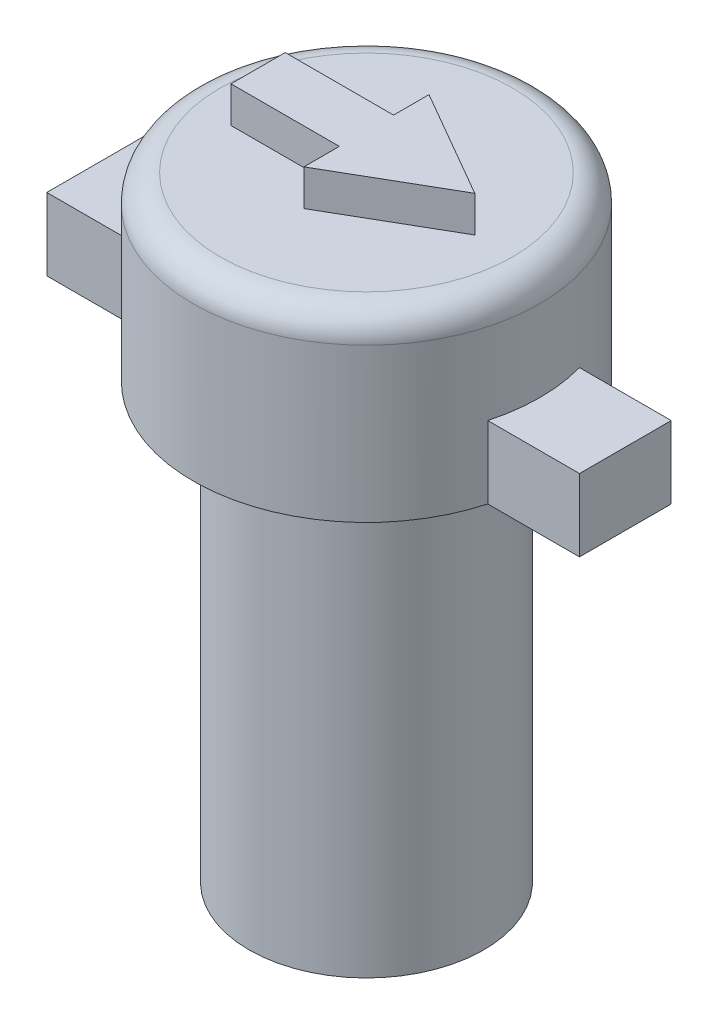
ISO-10303-21;
HEADER;
FILE_DESCRIPTION(('STEP AP214'),'2;1');
FILE_NAME('part.step','',(''),(''),'','','');
FILE_SCHEMA(('AUTOMOTIVE_DESIGN { 1 0 10303 214 1 1 1 1 }'));
ENDSEC;
DATA;
#1=APPLICATION_CONTEXT('core data for automotive mechanical design processes');
#2=APPLICATION_PROTOCOL_DEFINITION('international standard','automotive_design',2000,#1);
#3=PRODUCT_CONTEXT('',#1,'mechanical');
#4=PRODUCT('Part','Part','',(#3));
#5=PRODUCT_RELATED_PRODUCT_CATEGORY('part','',(#4));
#6=PRODUCT_DEFINITION_FORMATION('','',#4);
#7=PRODUCT_DEFINITION_CONTEXT('part definition',#1,'design');
#8=PRODUCT_DEFINITION('design','',#6,#7);
#9=PRODUCT_DEFINITION_SHAPE('','',#8);
#10=(LENGTH_UNIT() NAMED_UNIT(*) SI_UNIT(.MILLI.,.METRE.));
#11=(NAMED_UNIT(*) PLANE_ANGLE_UNIT() SI_UNIT($,.RADIAN.));
#12=(NAMED_UNIT(*) SI_UNIT($,.STERADIAN.) SOLID_ANGLE_UNIT());
#13=UNCERTAINTY_MEASURE_WITH_UNIT(LENGTH_MEASURE(1.E-05),#10,'distance_accuracy_value','');
#14=(GEOMETRIC_REPRESENTATION_CONTEXT(3) GLOBAL_UNCERTAINTY_ASSIGNED_CONTEXT((#13)) GLOBAL_UNIT_ASSIGNED_CONTEXT((#10,
#11,#12)) REPRESENTATION_CONTEXT('',''));
#15=CARTESIAN_POINT('',(0.,0.,0.));
#16=DIRECTION('',(0.,0.,1.));
#17=DIRECTION('',(1.,0.,0.));
#18=AXIS2_PLACEMENT_3D('',#15,#16,#17);
#19=CARTESIAN_POINT('',(0.,17.018,0.));
#20=DIRECTION('',(0.,1.,0.));
#21=DIRECTION('',(0.,0.,1.));
#22=AXIS2_PLACEMENT_3D('',#19,#20,#21);
#23=PLANE('',#22);
#24=CARTESIAN_POINT('',(0.,17.018,0.));
#25=DIRECTION('',(0.,1.,0.));
#26=DIRECTION('',(0.,0.,1.));
#27=AXIS2_PLACEMENT_3D('',#24,#25,#26);
#28=CIRCLE('',#27,4.05);
#29=CARTESIAN_POINT('',(0.,17.018,4.05));
#30=VERTEX_POINT('',#29);
#31=EDGE_CURVE('E73',#30,#30,#28,.T.);
#32=ORIENTED_EDGE('',*,*,#31,.T.);
#33=EDGE_LOOP('',(#32));
#34=FACE_BOUND('',#33,.T.);
#35=DIRECTION('',(-1.,0.,0.));
#36=VECTOR('',#35,1.);
#37=CARTESIAN_POINT('',(0.,17.018,-0.75));
#38=LINE('',#37,#36);
#39=CARTESIAN_POINT('',(0.,17.018,-0.75));
#40=VERTEX_POINT('',#39);
#41=CARTESIAN_POINT('',(-3.,17.018,-0.75));
#42=VERTEX_POINT('',#41);
#43=EDGE_CURVE('E286',#40,#42,#38,.T.);
#44=ORIENTED_EDGE('',*,*,#43,.F.);
#45=DIRECTION('',(0.,0.,1.));
#46=VECTOR('',#45,1.);
#47=CARTESIAN_POINT('',(0.,17.018,-1.73205080756888));
#48=LINE('',#47,#46);
#49=CARTESIAN_POINT('',(0.,17.018,-1.73205080756888));
#50=VERTEX_POINT('',#49);
#51=EDGE_CURVE('E214',#50,#40,#48,.T.);
#52=ORIENTED_EDGE('',*,*,#51,.F.);
#53=DIRECTION('',(-0.866025403784438,0.,-0.5));
#54=VECTOR('',#53,1.);
#55=CARTESIAN_POINT('',(3.,17.018,0.));
#56=LINE('',#55,#54);
#57=CARTESIAN_POINT('',(3.,17.018,0.));
#58=VERTEX_POINT('',#57);
#59=EDGE_CURVE('E264',#58,#50,#56,.T.);
#60=ORIENTED_EDGE('',*,*,#59,.F.);
#61=DIRECTION('',(0.866025403784439,0.,-0.5));
#62=VECTOR('',#61,1.);
#63=CARTESIAN_POINT('',(0.,17.018,1.73205080756888));
#64=LINE('',#63,#62);
#65=CARTESIAN_POINT('',(0.,17.018,1.73205080756888));
#66=VERTEX_POINT('',#65);
#67=EDGE_CURVE('E298',#66,#58,#64,.T.);
#68=ORIENTED_EDGE('',*,*,#67,.F.);
#69=DIRECTION('',(0.,0.,1.));
#70=VECTOR('',#69,1.);
#71=CARTESIAN_POINT('',(0.,17.018,0.75));
#72=LINE('',#71,#70);
#73=CARTESIAN_POINT('',(0.,17.018,0.75));
#74=VERTEX_POINT('',#73);
#75=EDGE_CURVE('E295',#74,#66,#72,.T.);
#76=ORIENTED_EDGE('',*,*,#75,.F.);
#77=DIRECTION('',(1.,0.,0.));
#78=VECTOR('',#77,1.);
#79=CARTESIAN_POINT('',(-3.,17.018,0.75));
#80=LINE('',#79,#78);
#81=CARTESIAN_POINT('',(-3.,17.018,0.75));
#82=VERTEX_POINT('',#81);
#83=EDGE_CURVE('E292',#82,#74,#80,.T.);
#84=ORIENTED_EDGE('',*,*,#83,.F.);
#85=DIRECTION('',(0.,0.,1.));
#86=VECTOR('',#85,1.);
#87=CARTESIAN_POINT('',(-3.,17.018,-0.75));
#88=LINE('',#87,#86);
#89=EDGE_CURVE('E289',#42,#82,#88,.T.);
#90=ORIENTED_EDGE('',*,*,#89,.F.);
#91=EDGE_LOOP('',(#44,#52,#60,#68,#76,#84,#90));
#92=FACE_BOUND('',#91,.T.);
#93=ADVANCED_FACE('F64',(#34,#92),#23,.T.);
#94=CARTESIAN_POINT('',(0.,12.018,0.));
#95=DIRECTION('',(0.,-1.,0.));
#96=DIRECTION('',(0.,0.,-1.));
#97=AXIS2_PLACEMENT_3D('',#94,#95,#96);
#98=CYLINDRICAL_SURFACE('',#97,3.25);
#99=CARTESIAN_POINT('',(0.,12.018,0.));
#100=DIRECTION('',(0.,1.,0.));
#101=DIRECTION('',(0.,0.,1.));
#102=AXIS2_PLACEMENT_3D('',#99,#100,#101);
#103=CIRCLE('',#102,3.25);
#104=CARTESIAN_POINT('',(0.,12.018,3.25));
#105=VERTEX_POINT('',#104);
#106=EDGE_CURVE('E333',#105,#105,#103,.T.);
#107=ORIENTED_EDGE('',*,*,#106,.F.);
#108=EDGE_LOOP('',(#107));
#109=FACE_BOUND('',#108,.T.);
#110=CARTESIAN_POINT('',(0.,0.,0.));
#111=DIRECTION('',(0.,1.,0.));
#112=DIRECTION('',(0.,0.,1.));
#113=AXIS2_PLACEMENT_3D('',#110,#111,#112);
#114=CIRCLE('',#113,3.25);
#115=CARTESIAN_POINT('',(0.,0.,3.25));
#116=VERTEX_POINT('',#115);
#117=EDGE_CURVE('E337',#116,#116,#114,.T.);
#118=ORIENTED_EDGE('',*,*,#117,.T.);
#119=EDGE_LOOP('',(#118));
#120=FACE_BOUND('',#119,.T.);
#121=ADVANCED_FACE('F363',(#109,#120),#98,.T.);
#122=CARTESIAN_POINT('',(0.,0.,0.));
#123=DIRECTION('',(0.,1.,0.));
#124=DIRECTION('',(0.,0.,1.));
#125=AXIS2_PLACEMENT_3D('',#122,#123,#124);
#126=PLANE('',#125);
#127=ORIENTED_EDGE('',*,*,#117,.F.);
#128=EDGE_LOOP('',(#127));
#129=FACE_BOUND('',#128,.T.);
#130=ADVANCED_FACE('F368',(#129),#126,.F.);
#131=CARTESIAN_POINT('',(0.,17.018,0.));
#132=DIRECTION('',(0.,-1.,0.));
#133=DIRECTION('',(0.,0.,-1.));
#134=AXIS2_PLACEMENT_3D('',#131,#132,#133);
#135=CYLINDRICAL_SURFACE('',#134,4.8);
#136=CARTESIAN_POINT('',(0.,12.018,0.));
#137=DIRECTION('',(0.,1.,0.));
#138=DIRECTION('',(0.,0.,1.));
#139=AXIS2_PLACEMENT_3D('',#136,#137,#138);
#140=CIRCLE('',#139,4.8);
#141=CARTESIAN_POINT('',(4.62894156368386,12.018,-1.27));
#142=VERTEX_POINT('',#141);
#143=CARTESIAN_POINT('',(-4.40578880565104,12.018,-1.905));
#144=VERTEX_POINT('',#143);
#145=EDGE_CURVE('E332',#142,#144,#140,.T.);
#146=ORIENTED_EDGE('',*,*,#145,.T.);
#147=DIRECTION('',(0.,-1.,0.));
#148=VECTOR('',#147,1.);
#149=CARTESIAN_POINT('',(-4.40578880565104,14.018,-1.905));
#150=LINE('',#149,#148);
#151=CARTESIAN_POINT('',(-4.40578880565104,14.018,-1.905));
#152=VERTEX_POINT('',#151);
#153=EDGE_CURVE('E80',#152,#144,#150,.T.);
#154=ORIENTED_EDGE('',*,*,#153,.F.);
#155=CARTESIAN_POINT('',(0.,14.018,0.));
#156=DIRECTION('',(0.,1.,0.));
#157=DIRECTION('',(0.,0.,-1.));
#158=AXIS2_PLACEMENT_3D('',#155,#156,#157);
#159=CIRCLE('',#158,4.8);
#160=CARTESIAN_POINT('',(-4.40578880565104,14.018,1.905));
#161=VERTEX_POINT('',#160);
#162=EDGE_CURVE('E84',#152,#161,#159,.T.);
#163=ORIENTED_EDGE('',*,*,#162,.T.);
#164=DIRECTION('',(0.,-1.,0.));
#165=VECTOR('',#164,1.);
#166=CARTESIAN_POINT('',(-4.40578880565104,14.018,1.905));
#167=LINE('',#166,#165);
#168=CARTESIAN_POINT('',(-4.40578880565104,12.018,1.905));
#169=VERTEX_POINT('',#168);
#170=EDGE_CURVE('E184',#161,#169,#167,.T.);
#171=ORIENTED_EDGE('',*,*,#170,.T.);
#172=CARTESIAN_POINT('',(4.62894156368386,12.018,1.27));
#173=VERTEX_POINT('',#172);
#174=EDGE_CURVE('E329',#169,#173,#140,.T.);
#175=ORIENTED_EDGE('',*,*,#174,.T.);
#176=DIRECTION('',(0.,-1.,0.));
#177=VECTOR('',#176,1.);
#178=CARTESIAN_POINT('',(4.62894156368386,14.018,1.27));
#179=LINE('',#178,#177);
#180=CARTESIAN_POINT('',(4.62894156368386,14.018,1.27));
#181=VERTEX_POINT('',#180);
#182=EDGE_CURVE('E230',#181,#173,#179,.T.);
#183=ORIENTED_EDGE('',*,*,#182,.F.);
#184=CARTESIAN_POINT('',(0.,14.018,0.));
#185=DIRECTION('',(0.,1.,0.));
#186=DIRECTION('',(0.,0.,-1.));
#187=AXIS2_PLACEMENT_3D('',#184,#185,#186);
#188=CIRCLE('',#187,4.8);
#189=CARTESIAN_POINT('',(4.62894156368386,14.018,-1.27));
#190=VERTEX_POINT('',#189);
#191=EDGE_CURVE('E239',#181,#190,#188,.T.);
#192=ORIENTED_EDGE('',*,*,#191,.T.);
#193=DIRECTION('',(0.,-1.,0.));
#194=VECTOR('',#193,1.);
#195=CARTESIAN_POINT('',(4.62894156368386,14.018,-1.27));
#196=LINE('',#195,#194);
#197=EDGE_CURVE('E219',#190,#142,#196,.T.);
#198=ORIENTED_EDGE('',*,*,#197,.T.);
#199=EDGE_LOOP('',(#146,#154,#163,#171,#175,#183,#192,#198));
#200=FACE_BOUND('',#199,.T.);
#201=CARTESIAN_POINT('',(0.,16.268,0.));
#202=DIRECTION('',(0.,1.,0.));
#203=DIRECTION('',(0.,0.,1.));
#204=AXIS2_PLACEMENT_3D('',#201,#202,#203);
#205=CIRCLE('',#204,4.8);
#206=CARTESIAN_POINT('',(0.,16.268,4.8));
#207=VERTEX_POINT('',#206);
#208=EDGE_CURVE('E12',#207,#207,#205,.F.);
#209=ORIENTED_EDGE('',*,*,#208,.T.);
#210=EDGE_LOOP('',(#209));
#211=FACE_BOUND('',#210,.T.);
#212=ADVANCED_FACE('F359',(#200,#211),#135,.T.);
#213=CARTESIAN_POINT('',(0.,12.018,0.));
#214=DIRECTION('',(0.,1.,0.));
#215=DIRECTION('',(0.,0.,1.));
#216=AXIS2_PLACEMENT_3D('',#213,#214,#215);
#217=PLANE('',#216);
#218=ORIENTED_EDGE('',*,*,#106,.T.);
#219=EDGE_LOOP('',(#218));
#220=FACE_BOUND('',#219,.T.);
#221=ORIENTED_EDGE('',*,*,#145,.F.);
#222=DIRECTION('',(1.,0.,0.));
#223=VECTOR('',#222,1.);
#224=CARTESIAN_POINT('',(7.16894156368386,12.018,-1.27));
#225=LINE('',#224,#223);
#226=CARTESIAN_POINT('',(7.16894156368386,12.018,-1.27));
#227=VERTEX_POINT('',#226);
#228=EDGE_CURVE('E206',#142,#227,#225,.T.);
#229=ORIENTED_EDGE('',*,*,#228,.T.);
#230=DIRECTION('',(0.,0.,1.));
#231=VECTOR('',#230,1.);
#232=CARTESIAN_POINT('',(7.16894156368386,12.018,1.27));
#233=LINE('',#232,#231);
#234=CARTESIAN_POINT('',(7.16894156368386,12.018,1.27));
#235=VERTEX_POINT('',#234);
#236=EDGE_CURVE('E238',#227,#235,#233,.T.);
#237=ORIENTED_EDGE('',*,*,#236,.T.);
#238=DIRECTION('',(-1.,0.,0.));
#239=VECTOR('',#238,1.);
#240=CARTESIAN_POINT('',(4.62894156368386,12.018,1.27));
#241=LINE('',#240,#239);
#242=EDGE_CURVE('E234',#235,#173,#241,.T.);
#243=ORIENTED_EDGE('',*,*,#242,.T.);
#244=ORIENTED_EDGE('',*,*,#174,.F.);
#245=DIRECTION('',(-1.,0.,0.));
#246=VECTOR('',#245,1.);
#247=CARTESIAN_POINT('',(-4.40578880565104,12.018,1.905));
#248=LINE('',#247,#246);
#249=CARTESIAN_POINT('',(-6.94578880565104,12.018,1.905));
#250=VERTEX_POINT('',#249);
#251=EDGE_CURVE('E203',#169,#250,#248,.T.);
#252=ORIENTED_EDGE('',*,*,#251,.T.);
#253=DIRECTION('',(0.,0.,-1.));
#254=VECTOR('',#253,1.);
#255=CARTESIAN_POINT('',(-6.94578880565104,12.018,1.905));
#256=LINE('',#255,#254);
#257=CARTESIAN_POINT('',(-6.94578880565104,12.018,-1.905));
#258=VERTEX_POINT('',#257);
#259=EDGE_CURVE('E177',#250,#258,#256,.T.);
#260=ORIENTED_EDGE('',*,*,#259,.T.);
#261=DIRECTION('',(1.,0.,0.));
#262=VECTOR('',#261,1.);
#263=CARTESIAN_POINT('',(-6.94578880565104,12.018,-1.905));
#264=LINE('',#263,#262);
#265=EDGE_CURVE('E198',#258,#144,#264,.T.);
#266=ORIENTED_EDGE('',*,*,#265,.T.);
#267=EDGE_LOOP('',(#221,#229,#237,#243,#244,#252,#260,#266));
#268=FACE_BOUND('',#267,.T.);
#269=ADVANCED_FACE('F348',(#220,#268),#217,.F.);
#270=CARTESIAN_POINT('',(0.,16.268,0.));
#271=DIRECTION('',(0.,1.,0.));
#272=DIRECTION('',(0.,0.,1.));
#273=AXIS2_PLACEMENT_3D('',#270,#271,#272);
#274=TOROIDAL_SURFACE('',#273,4.05,0.75);
#275=ORIENTED_EDGE('',*,*,#208,.F.);
#276=EDGE_LOOP('',(#275));
#277=FACE_BOUND('',#276,.T.);
#278=ORIENTED_EDGE('',*,*,#31,.F.);
#279=EDGE_LOOP('',(#278));
#280=FACE_BOUND('',#279,.T.);
#281=ADVANCED_FACE('F66',(#277,#280),#274,.T.);
#282=CARTESIAN_POINT('',(0.,18.018,-1.73205080756888));
#283=DIRECTION('',(1.,0.,0.));
#284=DIRECTION('',(0.,0.,-1.));
#285=AXIS2_PLACEMENT_3D('',#282,#283,#284);
#286=PLANE('',#285);
#287=ORIENTED_EDGE('',*,*,#51,.T.);
#288=DIRECTION('',(0.,-1.,0.));
#289=VECTOR('',#288,1.);
#290=CARTESIAN_POINT('',(0.,18.018,-0.75));
#291=LINE('',#290,#289);
#292=CARTESIAN_POINT('',(0.,18.018,-0.75));
#293=VERTEX_POINT('',#292);
#294=EDGE_CURVE('E326',#293,#40,#291,.T.);
#295=ORIENTED_EDGE('',*,*,#294,.F.);
#296=DIRECTION('',(0.,0.,1.));
#297=VECTOR('',#296,1.);
#298=CARTESIAN_POINT('',(0.,18.018,-1.73205080756888));
#299=LINE('',#298,#297);
#300=CARTESIAN_POINT('',(0.,18.018,-1.73205080756888));
#301=VERTEX_POINT('',#300);
#302=EDGE_CURVE('E259',#301,#293,#299,.T.);
#303=ORIENTED_EDGE('',*,*,#302,.F.);
#304=DIRECTION('',(0.,-1.,0.));
#305=VECTOR('',#304,1.);
#306=CARTESIAN_POINT('',(0.,18.018,-1.73205080756888));
#307=LINE('',#306,#305);
#308=EDGE_CURVE('E282',#301,#50,#307,.T.);
#309=ORIENTED_EDGE('',*,*,#308,.T.);
#310=EDGE_LOOP('',(#287,#295,#303,#309));
#311=FACE_BOUND('',#310,.T.);
#312=ADVANCED_FACE('F347',(#311),#286,.F.);
#313=CARTESIAN_POINT('',(0.,18.018,-0.75));
#314=DIRECTION('',(0.,0.,1.));
#315=DIRECTION('',(1.,0.,0.));
#316=AXIS2_PLACEMENT_3D('',#313,#314,#315);
#317=PLANE('',#316);
#318=ORIENTED_EDGE('',*,*,#43,.T.);
#319=DIRECTION('',(0.,-1.,0.));
#320=VECTOR('',#319,1.);
#321=CARTESIAN_POINT('',(-3.,18.018,-0.75));
#322=LINE('',#321,#320);
#323=CARTESIAN_POINT('',(-3.,18.018,-0.75));
#324=VERTEX_POINT('',#323);
#325=EDGE_CURVE('E322',#324,#42,#322,.T.);
#326=ORIENTED_EDGE('',*,*,#325,.F.);
#327=DIRECTION('',(-1.,0.,0.));
#328=VECTOR('',#327,1.);
#329=CARTESIAN_POINT('',(0.,18.018,-0.75));
#330=LINE('',#329,#328);
#331=EDGE_CURVE('E263',#293,#324,#330,.T.);
#332=ORIENTED_EDGE('',*,*,#331,.F.);
#333=ORIENTED_EDGE('',*,*,#294,.T.);
#334=EDGE_LOOP('',(#318,#326,#332,#333));
#335=FACE_BOUND('',#334,.T.);
#336=ADVANCED_FACE('F355',(#335),#317,.F.);
#337=CARTESIAN_POINT('',(-3.,18.018,-0.75));
#338=DIRECTION('',(1.,0.,0.));
#339=DIRECTION('',(0.,0.,-1.));
#340=AXIS2_PLACEMENT_3D('',#337,#338,#339);
#341=PLANE('',#340);
#342=ORIENTED_EDGE('',*,*,#89,.T.);
#343=DIRECTION('',(0.,-1.,0.));
#344=VECTOR('',#343,1.);
#345=CARTESIAN_POINT('',(-3.,18.018,0.75));
#346=LINE('',#345,#344);
#347=CARTESIAN_POINT('',(-3.,18.018,0.75));
#348=VERTEX_POINT('',#347);
#349=EDGE_CURVE('E318',#348,#82,#346,.T.);
#350=ORIENTED_EDGE('',*,*,#349,.F.);
#351=DIRECTION('',(0.,0.,1.));
#352=VECTOR('',#351,1.);
#353=CARTESIAN_POINT('',(-3.,18.018,-0.75));
#354=LINE('',#353,#352);
#355=EDGE_CURVE('E267',#324,#348,#354,.T.);
#356=ORIENTED_EDGE('',*,*,#355,.F.);
#357=ORIENTED_EDGE('',*,*,#325,.T.);
#358=EDGE_LOOP('',(#342,#350,#356,#357));
#359=FACE_BOUND('',#358,.T.);
#360=ADVANCED_FACE('F418',(#359),#341,.F.);
#361=CARTESIAN_POINT('',(-3.,18.018,0.75));
#362=DIRECTION('',(0.,0.,-1.));
#363=DIRECTION('',(-1.,0.,0.));
#364=AXIS2_PLACEMENT_3D('',#361,#362,#363);
#365=PLANE('',#364);
#366=ORIENTED_EDGE('',*,*,#83,.T.);
#367=DIRECTION('',(0.,-1.,0.));
#368=VECTOR('',#367,1.);
#369=CARTESIAN_POINT('',(0.,18.018,0.75));
#370=LINE('',#369,#368);
#371=CARTESIAN_POINT('',(0.,18.018,0.75));
#372=VERTEX_POINT('',#371);
#373=EDGE_CURVE('E314',#372,#74,#370,.T.);
#374=ORIENTED_EDGE('',*,*,#373,.F.);
#375=DIRECTION('',(1.,0.,0.));
#376=VECTOR('',#375,1.);
#377=CARTESIAN_POINT('',(-3.,18.018,0.75));
#378=LINE('',#377,#376);
#379=EDGE_CURVE('E270',#348,#372,#378,.T.);
#380=ORIENTED_EDGE('',*,*,#379,.F.);
#381=ORIENTED_EDGE('',*,*,#349,.T.);
#382=EDGE_LOOP('',(#366,#374,#380,#381));
#383=FACE_BOUND('',#382,.T.);
#384=ADVANCED_FACE('F426',(#383),#365,.F.);
#385=CARTESIAN_POINT('',(0.,18.018,0.75));
#386=DIRECTION('',(1.,0.,0.));
#387=DIRECTION('',(0.,0.,-1.));
#388=AXIS2_PLACEMENT_3D('',#385,#386,#387);
#389=PLANE('',#388);
#390=ORIENTED_EDGE('',*,*,#75,.T.);
#391=DIRECTION('',(0.,-1.,0.));
#392=VECTOR('',#391,1.);
#393=CARTESIAN_POINT('',(0.,18.018,1.73205080756888));
#394=LINE('',#393,#392);
#395=CARTESIAN_POINT('',(0.,18.018,1.73205080756888));
#396=VERTEX_POINT('',#395);
#397=EDGE_CURVE('E310',#396,#66,#394,.T.);
#398=ORIENTED_EDGE('',*,*,#397,.F.);
#399=DIRECTION('',(0.,0.,1.));
#400=VECTOR('',#399,1.);
#401=CARTESIAN_POINT('',(0.,18.018,0.75));
#402=LINE('',#401,#400);
#403=EDGE_CURVE('E273',#372,#396,#402,.T.);
#404=ORIENTED_EDGE('',*,*,#403,.F.);
#405=ORIENTED_EDGE('',*,*,#373,.T.);
#406=EDGE_LOOP('',(#390,#398,#404,#405));
#407=FACE_BOUND('',#406,.T.);
#408=ADVANCED_FACE('F435',(#407),#389,.F.);
#409=CARTESIAN_POINT('',(0.,18.018,1.73205080756888));
#410=DIRECTION('',(-0.5,0.,-0.866025403784439));
#411=DIRECTION('',(-0.866025403784439,0.,0.5));
#412=AXIS2_PLACEMENT_3D('',#409,#410,#411);
#413=PLANE('',#412);
#414=ORIENTED_EDGE('',*,*,#67,.T.);
#415=DIRECTION('',(0.,-1.,0.));
#416=VECTOR('',#415,1.);
#417=CARTESIAN_POINT('',(3.,18.018,0.));
#418=LINE('',#417,#416);
#419=CARTESIAN_POINT('',(3.,18.018,0.));
#420=VERTEX_POINT('',#419);
#421=EDGE_CURVE('E307',#420,#58,#418,.T.);
#422=ORIENTED_EDGE('',*,*,#421,.F.);
#423=DIRECTION('',(0.866025403784439,0.,-0.5));
#424=VECTOR('',#423,1.);
#425=CARTESIAN_POINT('',(0.,18.018,1.73205080756888));
#426=LINE('',#425,#424);
#427=EDGE_CURVE('E276',#396,#420,#426,.T.);
#428=ORIENTED_EDGE('',*,*,#427,.F.);
#429=ORIENTED_EDGE('',*,*,#397,.T.);
#430=EDGE_LOOP('',(#414,#422,#428,#429));
#431=FACE_BOUND('',#430,.T.);
#432=ADVANCED_FACE('F444',(#431),#413,.F.);
#433=CARTESIAN_POINT('',(3.,18.018,0.));
#434=DIRECTION('',(-0.5,0.,0.866025403784438));
#435=DIRECTION('',(0.866025403784438,0.,0.5));
#436=AXIS2_PLACEMENT_3D('',#433,#434,#435);
#437=PLANE('',#436);
#438=ORIENTED_EDGE('',*,*,#59,.T.);
#439=ORIENTED_EDGE('',*,*,#308,.F.);
#440=DIRECTION('',(-0.866025403784438,0.,-0.5));
#441=VECTOR('',#440,1.);
#442=CARTESIAN_POINT('',(3.,18.018,0.));
#443=LINE('',#442,#441);
#444=EDGE_CURVE('E279',#420,#301,#443,.T.);
#445=ORIENTED_EDGE('',*,*,#444,.F.);
#446=ORIENTED_EDGE('',*,*,#421,.T.);
#447=EDGE_LOOP('',(#438,#439,#445,#446));
#448=FACE_BOUND('',#447,.T.);
#449=ADVANCED_FACE('F453',(#448),#437,.F.);
#450=CARTESIAN_POINT('',(0.,18.018,0.));
#451=DIRECTION('',(0.,-1.,0.));
#452=DIRECTION('',(0.,0.,-1.));
#453=AXIS2_PLACEMENT_3D('',#450,#451,#452);
#454=PLANE('',#453);
#455=ORIENTED_EDGE('',*,*,#302,.T.);
#456=ORIENTED_EDGE('',*,*,#331,.T.);
#457=ORIENTED_EDGE('',*,*,#355,.T.);
#458=ORIENTED_EDGE('',*,*,#379,.T.);
#459=ORIENTED_EDGE('',*,*,#403,.T.);
#460=ORIENTED_EDGE('',*,*,#427,.T.);
#461=ORIENTED_EDGE('',*,*,#444,.T.);
#462=EDGE_LOOP('',(#455,#456,#457,#458,#459,#460,#461));
#463=FACE_BOUND('',#462,.T.);
#464=ADVANCED_FACE('F462',(#463),#454,.F.);
#465=CARTESIAN_POINT('',(4.62894156368386,14.018,1.27));
#466=DIRECTION('',(0.,0.,1.));
#467=DIRECTION('',(1.,0.,0.));
#468=AXIS2_PLACEMENT_3D('',#465,#466,#467);
#469=PLANE('',#468);
#470=ORIENTED_EDGE('',*,*,#242,.F.);
#471=DIRECTION('',(0.,-1.,0.));
#472=VECTOR('',#471,1.);
#473=CARTESIAN_POINT('',(7.16894156368386,14.018,1.27));
#474=LINE('',#473,#472);
#475=CARTESIAN_POINT('',(7.16894156368386,14.018,1.27));
#476=VERTEX_POINT('',#475);
#477=EDGE_CURVE('E227',#476,#235,#474,.T.);
#478=ORIENTED_EDGE('',*,*,#477,.F.);
#479=DIRECTION('',(-1.,0.,0.));
#480=VECTOR('',#479,1.);
#481=CARTESIAN_POINT('',(4.62894156368386,14.018,1.27));
#482=LINE('',#481,#480);
#483=EDGE_CURVE('E223',#476,#181,#482,.T.);
#484=ORIENTED_EDGE('',*,*,#483,.T.);
#485=ORIENTED_EDGE('',*,*,#182,.T.);
#486=EDGE_LOOP('',(#470,#478,#484,#485));
#487=FACE_BOUND('',#486,.T.);
#488=ADVANCED_FACE('F471',(#487),#469,.T.);
#489=CARTESIAN_POINT('',(7.16894156368386,14.018,1.27));
#490=DIRECTION('',(1.,0.,0.));
#491=DIRECTION('',(0.,0.,-1.));
#492=AXIS2_PLACEMENT_3D('',#489,#490,#491);
#493=PLANE('',#492);
#494=ORIENTED_EDGE('',*,*,#236,.F.);
#495=DIRECTION('',(0.,-1.,0.));
#496=VECTOR('',#495,1.);
#497=CARTESIAN_POINT('',(7.16894156368386,14.018,-1.27));
#498=LINE('',#497,#496);
#499=CARTESIAN_POINT('',(7.16894156368386,14.018,-1.27));
#500=VERTEX_POINT('',#499);
#501=EDGE_CURVE('E224',#500,#227,#498,.T.);
#502=ORIENTED_EDGE('',*,*,#501,.F.);
#503=DIRECTION('',(0.,0.,1.));
#504=VECTOR('',#503,1.);
#505=CARTESIAN_POINT('',(7.16894156368386,14.018,1.27));
#506=LINE('',#505,#504);
#507=EDGE_CURVE('E249',#500,#476,#506,.T.);
#508=ORIENTED_EDGE('',*,*,#507,.T.);
#509=ORIENTED_EDGE('',*,*,#477,.T.);
#510=EDGE_LOOP('',(#494,#502,#508,#509));
#511=FACE_BOUND('',#510,.T.);
#512=ADVANCED_FACE('F480',(#511),#493,.T.);
#513=CARTESIAN_POINT('',(7.16894156368386,14.018,-1.27));
#514=DIRECTION('',(0.,0.,-1.));
#515=DIRECTION('',(-1.,0.,0.));
#516=AXIS2_PLACEMENT_3D('',#513,#514,#515);
#517=PLANE('',#516);
#518=ORIENTED_EDGE('',*,*,#228,.F.);
#519=ORIENTED_EDGE('',*,*,#197,.F.);
#520=DIRECTION('',(1.,0.,0.));
#521=VECTOR('',#520,1.);
#522=CARTESIAN_POINT('',(7.16894156368386,14.018,-1.27));
#523=LINE('',#522,#521);
#524=EDGE_CURVE('E253',#190,#500,#523,.T.);
#525=ORIENTED_EDGE('',*,*,#524,.T.);
#526=ORIENTED_EDGE('',*,*,#501,.T.);
#527=EDGE_LOOP('',(#518,#519,#525,#526));
#528=FACE_BOUND('',#527,.T.);
#529=ADVANCED_FACE('F490',(#528),#517,.T.);
#530=CARTESIAN_POINT('',(0.,14.018,0.));
#531=DIRECTION('',(0.,-1.,0.));
#532=DIRECTION('',(0.,0.,-1.));
#533=AXIS2_PLACEMENT_3D('',#530,#531,#532);
#534=PLANE('',#533);
#535=ORIENTED_EDGE('',*,*,#191,.F.);
#536=ORIENTED_EDGE('',*,*,#483,.F.);
#537=ORIENTED_EDGE('',*,*,#507,.F.);
#538=ORIENTED_EDGE('',*,*,#524,.F.);
#539=EDGE_LOOP('',(#535,#536,#537,#538));
#540=FACE_BOUND('',#539,.T.);
#541=ADVANCED_FACE('F499',(#540),#534,.F.);
#542=CARTESIAN_POINT('',(-6.94578880565104,14.018,-1.905));
#543=DIRECTION('',(0.,0.,-1.));
#544=DIRECTION('',(-1.,0.,0.));
#545=AXIS2_PLACEMENT_3D('',#542,#543,#544);
#546=PLANE('',#545);
#547=ORIENTED_EDGE('',*,*,#265,.F.);
#548=DIRECTION('',(0.,-1.,0.));
#549=VECTOR('',#548,1.);
#550=CARTESIAN_POINT('',(-6.94578880565104,14.018,-1.905));
#551=LINE('',#550,#549);
#552=CARTESIAN_POINT('',(-6.94578880565104,14.018,-1.905));
#553=VERTEX_POINT('',#552);
#554=EDGE_CURVE('E183',#553,#258,#551,.T.);
#555=ORIENTED_EDGE('',*,*,#554,.F.);
#556=DIRECTION('',(1.,0.,0.));
#557=VECTOR('',#556,1.);
#558=CARTESIAN_POINT('',(-6.94578880565104,14.018,-1.905));
#559=LINE('',#558,#557);
#560=EDGE_CURVE('E191',#553,#152,#559,.T.);
#561=ORIENTED_EDGE('',*,*,#560,.T.);
#562=ORIENTED_EDGE('',*,*,#153,.T.);
#563=EDGE_LOOP('',(#547,#555,#561,#562));
#564=FACE_BOUND('',#563,.T.);
#565=ADVANCED_FACE('F508',(#564),#546,.T.);
#566=CARTESIAN_POINT('',(-6.94578880565104,14.018,1.905));
#567=DIRECTION('',(-1.,0.,0.));
#568=DIRECTION('',(0.,0.,1.));
#569=AXIS2_PLACEMENT_3D('',#566,#567,#568);
#570=PLANE('',#569);
#571=ORIENTED_EDGE('',*,*,#259,.F.);
#572=DIRECTION('',(0.,-1.,0.));
#573=VECTOR('',#572,1.);
#574=CARTESIAN_POINT('',(-6.94578880565104,14.018,1.905));
#575=LINE('',#574,#573);
#576=CARTESIAN_POINT('',(-6.94578880565104,14.018,1.905));
#577=VERTEX_POINT('',#576);
#578=EDGE_CURVE('E171',#577,#250,#575,.T.);
#579=ORIENTED_EDGE('',*,*,#578,.F.);
#580=DIRECTION('',(0.,0.,-1.));
#581=VECTOR('',#580,1.);
#582=CARTESIAN_POINT('',(-6.94578880565104,14.018,1.905));
#583=LINE('',#582,#581);
#584=EDGE_CURVE('E174',#577,#553,#583,.T.);
#585=ORIENTED_EDGE('',*,*,#584,.T.);
#586=ORIENTED_EDGE('',*,*,#554,.T.);
#587=EDGE_LOOP('',(#571,#579,#585,#586));
#588=FACE_BOUND('',#587,.T.);
#589=ADVANCED_FACE('F173',(#588),#570,.T.);
#590=CARTESIAN_POINT('',(-4.40578880565104,14.018,1.905));
#591=DIRECTION('',(0.,0.,1.));
#592=DIRECTION('',(1.,0.,0.));
#593=AXIS2_PLACEMENT_3D('',#590,#591,#592);
#594=PLANE('',#593);
#595=ORIENTED_EDGE('',*,*,#251,.F.);
#596=ORIENTED_EDGE('',*,*,#170,.F.);
#597=DIRECTION('',(-1.,0.,0.));
#598=VECTOR('',#597,1.);
#599=CARTESIAN_POINT('',(-4.40578880565104,14.018,1.905));
#600=LINE('',#599,#598);
#601=EDGE_CURVE('E189',#161,#577,#600,.T.);
#602=ORIENTED_EDGE('',*,*,#601,.T.);
#603=ORIENTED_EDGE('',*,*,#578,.T.);
#604=EDGE_LOOP('',(#595,#596,#602,#603));
#605=FACE_BOUND('',#604,.T.);
#606=ADVANCED_FACE('F194',(#605),#594,.T.);
#607=CARTESIAN_POINT('',(0.,14.018,0.));
#608=DIRECTION('',(0.,-1.,0.));
#609=DIRECTION('',(0.,0.,-1.));
#610=AXIS2_PLACEMENT_3D('',#607,#608,#609);
#611=PLANE('',#610);
#612=ORIENTED_EDGE('',*,*,#162,.F.);
#613=ORIENTED_EDGE('',*,*,#560,.F.);
#614=ORIENTED_EDGE('',*,*,#584,.F.);
#615=ORIENTED_EDGE('',*,*,#601,.F.);
#616=EDGE_LOOP('',(#612,#613,#614,#615));
#617=FACE_BOUND('',#616,.T.);
#618=ADVANCED_FACE('F188',(#617),#611,.F.);
#619=CLOSED_SHELL('',(#93,#121,#130,#212,#269,#281,#312,#336,#360,#384,#408,#432,#449,#464,#488,
#512,#529,#541,#565,#589,#606,#618));
#620=MANIFOLD_SOLID_BREP('B2',#619);
#621=ADVANCED_BREP_SHAPE_REPRESENTATION('',(#18,#620),#14);
#622=SHAPE_DEFINITION_REPRESENTATION(#9,#621);
ENDSEC;
END-ISO-10303-21;
